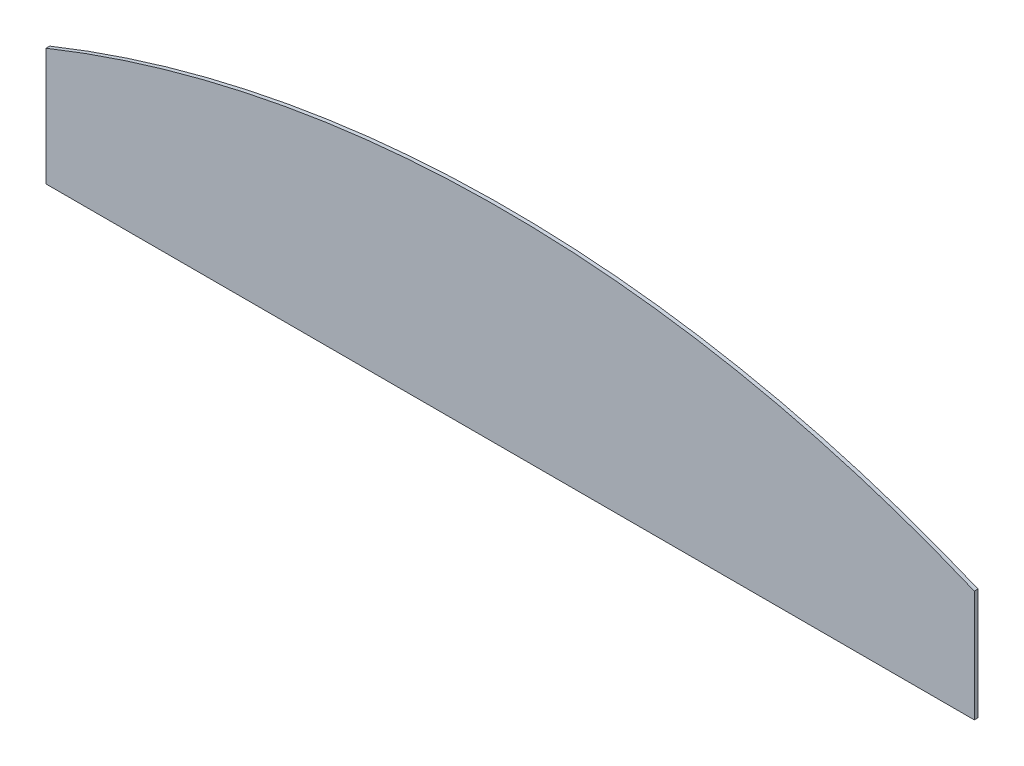
ISO-10303-21;
HEADER;
FILE_DESCRIPTION(('STEP AP214'),'2;1');
FILE_NAME('part.step','',(''),(''),'','','');
FILE_SCHEMA(('AUTOMOTIVE_DESIGN { 1 0 10303 214 1 1 1 1 }'));
ENDSEC;
DATA;
#1=APPLICATION_CONTEXT('core data for automotive mechanical design processes');
#2=APPLICATION_PROTOCOL_DEFINITION('international standard','automotive_design',2000,#1);
#3=PRODUCT_CONTEXT('',#1,'mechanical');
#4=PRODUCT('Part','Part','',(#3));
#5=PRODUCT_RELATED_PRODUCT_CATEGORY('part','',(#4));
#6=PRODUCT_DEFINITION_FORMATION('','',#4);
#7=PRODUCT_DEFINITION_CONTEXT('part definition',#1,'design');
#8=PRODUCT_DEFINITION('design','',#6,#7);
#9=PRODUCT_DEFINITION_SHAPE('','',#8);
#10=(LENGTH_UNIT() NAMED_UNIT(*) SI_UNIT(.MILLI.,.METRE.));
#11=(NAMED_UNIT(*) PLANE_ANGLE_UNIT() SI_UNIT($,.RADIAN.));
#12=(NAMED_UNIT(*) SI_UNIT($,.STERADIAN.) SOLID_ANGLE_UNIT());
#13=UNCERTAINTY_MEASURE_WITH_UNIT(LENGTH_MEASURE(1.E-05),#10,'distance_accuracy_value','');
#14=(GEOMETRIC_REPRESENTATION_CONTEXT(3) GLOBAL_UNCERTAINTY_ASSIGNED_CONTEXT((#13)) GLOBAL_UNIT_ASSIGNED_CONTEXT((#10,
#11,#12)) REPRESENTATION_CONTEXT('',''));
#15=CARTESIAN_POINT('',(0.,0.,0.));
#16=DIRECTION('',(0.,0.,1.));
#17=DIRECTION('',(1.,0.,0.));
#18=AXIS2_PLACEMENT_3D('',#15,#16,#17);
#19=CARTESIAN_POINT('',(-187.007874015748,415.580621178672,1.5));
#20=DIRECTION('',(1.,0.,0.));
#21=DIRECTION('',(0.,0.,-1.));
#22=AXIS2_PLACEMENT_3D('',#19,#20,#21);
#23=PLANE('',#22);
#24=DIRECTION('',(0.,-1.,0.));
#25=VECTOR('',#24,1.);
#26=CARTESIAN_POINT('',(-187.007874015748,415.580621178672,0.));
#27=LINE('',#26,#25);
#28=CARTESIAN_POINT('',(-187.007874015748,463.711176332974,0.));
#29=VERTEX_POINT('',#28);
#30=CARTESIAN_POINT('',(-187.007874015748,415.580621178672,0.));
#31=VERTEX_POINT('',#30);
#32=EDGE_CURVE('E96',#29,#31,#27,.T.);
#33=ORIENTED_EDGE('',*,*,#32,.T.);
#34=DIRECTION('',(0.,0.,-1.));
#35=VECTOR('',#34,1.);
#36=CARTESIAN_POINT('',(-187.007874015748,415.580621178672,1.5));
#37=LINE('',#36,#35);
#38=CARTESIAN_POINT('',(-187.007874015748,415.580621178672,1.5));
#39=VERTEX_POINT('',#38);
#40=EDGE_CURVE('E11',#39,#31,#37,.T.);
#41=ORIENTED_EDGE('',*,*,#40,.F.);
#42=DIRECTION('',(0.,-1.,0.));
#43=VECTOR('',#42,1.);
#44=CARTESIAN_POINT('',(-187.007874015748,415.580621178672,1.5));
#45=LINE('',#44,#43);
#46=CARTESIAN_POINT('',(-187.007874015748,463.711176332974,1.5));
#47=VERTEX_POINT('',#46);
#48=EDGE_CURVE('E84',#47,#39,#45,.T.);
#49=ORIENTED_EDGE('',*,*,#48,.F.);
#50=DIRECTION('',(0.,0.,-1.));
#51=VECTOR('',#50,1.);
#52=CARTESIAN_POINT('',(-187.007874015748,463.711176332974,1.5));
#53=LINE('',#52,#51);
#54=EDGE_CURVE('E92',#47,#29,#53,.T.);
#55=ORIENTED_EDGE('',*,*,#54,.T.);
#56=EDGE_LOOP('',(#33,#41,#49,#55));
#57=FACE_BOUND('',#56,.T.);
#58=ADVANCED_FACE('F33',(#57),#23,.F.);
#59=CARTESIAN_POINT('',(-187.007874015748,415.580621178672,1.5));
#60=DIRECTION('',(0.,1.,0.));
#61=DIRECTION('',(0.,0.,1.));
#62=AXIS2_PLACEMENT_3D('',#59,#60,#61);
#63=PLANE('',#62);
#64=DIRECTION('',(1.,0.,0.));
#65=VECTOR('',#64,1.);
#66=CARTESIAN_POINT('',(-187.007874015748,415.580621178672,0.));
#67=LINE('',#66,#65);
#68=CARTESIAN_POINT('',(192.992125984252,415.580621178672,0.));
#69=VERTEX_POINT('',#68);
#70=EDGE_CURVE('E88',#31,#69,#67,.T.);
#71=ORIENTED_EDGE('',*,*,#70,.T.);
#72=DIRECTION('',(0.,0.,-1.));
#73=VECTOR('',#72,1.);
#74=CARTESIAN_POINT('',(192.992125984252,415.580621178672,1.5));
#75=LINE('',#74,#73);
#76=CARTESIAN_POINT('',(192.992125984252,415.580621178672,1.5));
#77=VERTEX_POINT('',#76);
#78=EDGE_CURVE('E41',#77,#69,#75,.T.);
#79=ORIENTED_EDGE('',*,*,#78,.F.);
#80=DIRECTION('',(1.,0.,0.));
#81=VECTOR('',#80,1.);
#82=CARTESIAN_POINT('',(-187.007874015748,415.580621178672,1.5));
#83=LINE('',#82,#81);
#84=EDGE_CURVE('E79',#39,#77,#83,.T.);
#85=ORIENTED_EDGE('',*,*,#84,.F.);
#86=ORIENTED_EDGE('',*,*,#40,.T.);
#87=EDGE_LOOP('',(#71,#79,#85,#86));
#88=FACE_BOUND('',#87,.T.);
#89=ADVANCED_FACE('F87',(#88),#63,.F.);
#90=CARTESIAN_POINT('',(192.992125984252,415.580621178672,1.5));
#91=DIRECTION('',(-1.,0.,0.));
#92=DIRECTION('',(0.,0.,1.));
#93=AXIS2_PLACEMENT_3D('',#90,#91,#92);
#94=PLANE('',#93);
#95=DIRECTION('',(0.,1.,0.));
#96=VECTOR('',#95,1.);
#97=CARTESIAN_POINT('',(192.992125984252,415.580621178672,0.));
#98=LINE('',#97,#96);
#99=CARTESIAN_POINT('',(192.992125984252,461.252684878992,0.));
#100=VERTEX_POINT('',#99);
#101=EDGE_CURVE('E66',#69,#100,#98,.T.);
#102=ORIENTED_EDGE('',*,*,#101,.T.);
#103=DIRECTION('',(0.,0.,-1.));
#104=VECTOR('',#103,1.);
#105=CARTESIAN_POINT('',(192.992125984252,461.252684878992,1.5));
#106=LINE('',#105,#104);
#107=CARTESIAN_POINT('',(192.992125984252,461.252684878992,1.5));
#108=VERTEX_POINT('',#107);
#109=EDGE_CURVE('E89',#108,#100,#106,.T.);
#110=ORIENTED_EDGE('',*,*,#109,.F.);
#111=DIRECTION('',(0.,1.,0.));
#112=VECTOR('',#111,1.);
#113=CARTESIAN_POINT('',(192.992125984252,415.580621178672,1.5));
#114=LINE('',#113,#112);
#115=EDGE_CURVE('E82',#77,#108,#114,.T.);
#116=ORIENTED_EDGE('',*,*,#115,.F.);
#117=ORIENTED_EDGE('',*,*,#78,.T.);
#118=EDGE_LOOP('',(#102,#110,#116,#117));
#119=FACE_BOUND('',#118,.T.);
#120=ADVANCED_FACE('F90',(#119),#94,.F.);
#121=CARTESIAN_POINT('',(0.,0.,1.5));
#122=DIRECTION('',(0.,0.,-1.));
#123=DIRECTION('',(-1.,0.,0.));
#124=AXIS2_PLACEMENT_3D('',#121,#122,#123);
#125=CYLINDRICAL_SURFACE('',#124,500.);
#126=CARTESIAN_POINT('',(0.,0.,0.));
#127=DIRECTION('',(0.,0.,1.));
#128=DIRECTION('',(1.,0.,0.));
#129=AXIS2_PLACEMENT_3D('',#126,#127,#128);
#130=CIRCLE('',#129,500.);
#131=EDGE_CURVE('E72',#100,#29,#130,.T.);
#132=ORIENTED_EDGE('',*,*,#131,.T.);
#133=ORIENTED_EDGE('',*,*,#54,.F.);
#134=CARTESIAN_POINT('',(0.,0.,1.5));
#135=DIRECTION('',(0.,0.,1.));
#136=DIRECTION('',(1.,0.,0.));
#137=AXIS2_PLACEMENT_3D('',#134,#135,#136);
#138=CIRCLE('',#137,500.);
#139=EDGE_CURVE('E49',#108,#47,#138,.T.);
#140=ORIENTED_EDGE('',*,*,#139,.F.);
#141=ORIENTED_EDGE('',*,*,#109,.T.);
#142=EDGE_LOOP('',(#132,#133,#140,#141));
#143=FACE_BOUND('',#142,.T.);
#144=ADVANCED_FACE('F103',(#143),#125,.T.);
#145=CARTESIAN_POINT('',(0.,0.,1.5));
#146=DIRECTION('',(0.,0.,1.));
#147=DIRECTION('',(1.,0.,0.));
#148=AXIS2_PLACEMENT_3D('',#145,#146,#147);
#149=PLANE('',#148);
#150=ORIENTED_EDGE('',*,*,#48,.T.);
#151=ORIENTED_EDGE('',*,*,#84,.T.);
#152=ORIENTED_EDGE('',*,*,#115,.T.);
#153=ORIENTED_EDGE('',*,*,#139,.T.);
#154=EDGE_LOOP('',(#150,#151,#152,#153));
#155=FACE_BOUND('',#154,.T.);
#156=ADVANCED_FACE('F80',(#155),#149,.T.);
#157=CARTESIAN_POINT('',(0.,0.,0.));
#158=DIRECTION('',(0.,0.,1.));
#159=DIRECTION('',(1.,0.,0.));
#160=AXIS2_PLACEMENT_3D('',#157,#158,#159);
#161=PLANE('',#160);
#162=ORIENTED_EDGE('',*,*,#32,.F.);
#163=ORIENTED_EDGE('',*,*,#131,.F.);
#164=ORIENTED_EDGE('',*,*,#101,.F.);
#165=ORIENTED_EDGE('',*,*,#70,.F.);
#166=EDGE_LOOP('',(#162,#163,#164,#165));
#167=FACE_BOUND('',#166,.T.);
#168=ADVANCED_FACE('F106',(#167),#161,.F.);
#169=CLOSED_SHELL('',(#58,#89,#120,#144,#156,#168));
#170=MANIFOLD_SOLID_BREP('B2',#169);
#171=ADVANCED_BREP_SHAPE_REPRESENTATION('',(#18,#170),#14);
#172=SHAPE_DEFINITION_REPRESENTATION(#9,#171);
ENDSEC;
END-ISO-10303-21;
